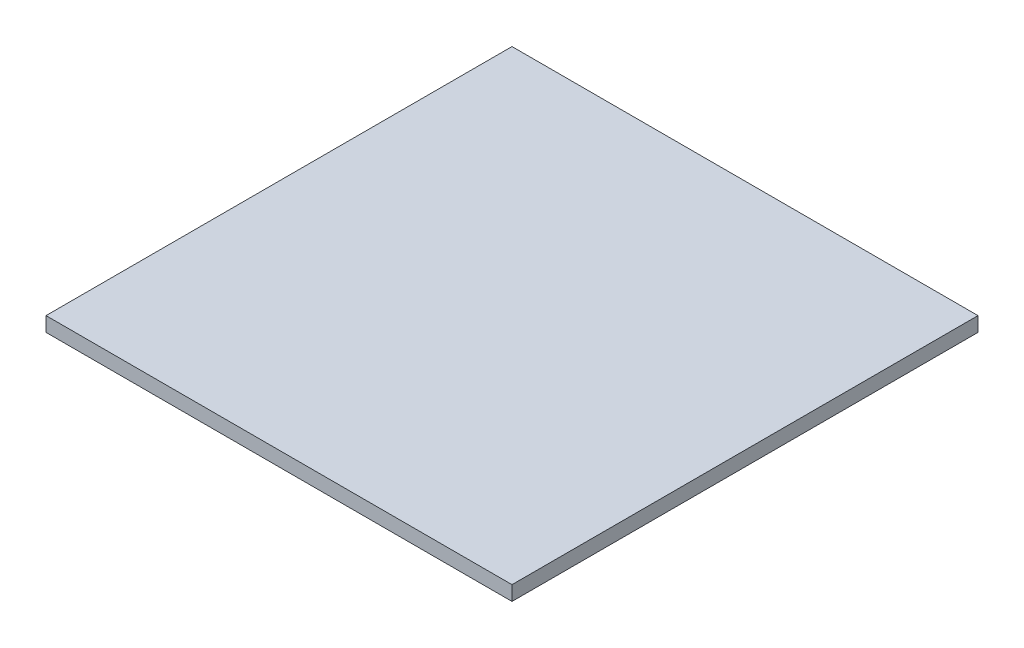
ISO-10303-21;
HEADER;
FILE_DESCRIPTION(('STEP AP214'),'2;1');
FILE_NAME('part.step','',(''),(''),'','','');
FILE_SCHEMA(('AUTOMOTIVE_DESIGN { 1 0 10303 214 1 1 1 1 }'));
ENDSEC;
DATA;
#1=APPLICATION_CONTEXT('core data for automotive mechanical design processes');
#2=APPLICATION_PROTOCOL_DEFINITION('international standard','automotive_design',2000,#1);
#3=PRODUCT_CONTEXT('',#1,'mechanical');
#4=PRODUCT('Part','Part','',(#3));
#5=PRODUCT_RELATED_PRODUCT_CATEGORY('part','',(#4));
#6=PRODUCT_DEFINITION_FORMATION('','',#4);
#7=PRODUCT_DEFINITION_CONTEXT('part definition',#1,'design');
#8=PRODUCT_DEFINITION('design','',#6,#7);
#9=PRODUCT_DEFINITION_SHAPE('','',#8);
#10=(LENGTH_UNIT() NAMED_UNIT(*) SI_UNIT(.MILLI.,.METRE.));
#11=(NAMED_UNIT(*) PLANE_ANGLE_UNIT() SI_UNIT($,.RADIAN.));
#12=(NAMED_UNIT(*) SI_UNIT($,.STERADIAN.) SOLID_ANGLE_UNIT());
#13=UNCERTAINTY_MEASURE_WITH_UNIT(LENGTH_MEASURE(1.E-05),#10,'distance_accuracy_value','');
#14=(GEOMETRIC_REPRESENTATION_CONTEXT(3) GLOBAL_UNCERTAINTY_ASSIGNED_CONTEXT((#13)) GLOBAL_UNIT_ASSIGNED_CONTEXT((#10,
#11,#12)) REPRESENTATION_CONTEXT('',''));
#15=CARTESIAN_POINT('',(0.,0.,0.));
#16=DIRECTION('',(0.,0.,1.));
#17=DIRECTION('',(1.,0.,0.));
#18=AXIS2_PLACEMENT_3D('',#15,#16,#17);
#19=CARTESIAN_POINT('',(0.,1.5875,0.));
#20=DIRECTION('',(1.,0.,0.));
#21=DIRECTION('',(0.,0.,-1.));
#22=AXIS2_PLACEMENT_3D('',#19,#20,#21);
#23=PLANE('',#22);
#24=DIRECTION('',(0.,0.,1.));
#25=VECTOR('',#24,1.);
#26=CARTESIAN_POINT('',(0.,0.,0.));
#27=LINE('',#26,#25);
#28=CARTESIAN_POINT('',(0.,0.,-50.8));
#29=VERTEX_POINT('',#28);
#30=CARTESIAN_POINT('',(0.,0.,0.));
#31=VERTEX_POINT('',#30);
#32=EDGE_CURVE('E96',#29,#31,#27,.T.);
#33=ORIENTED_EDGE('',*,*,#32,.T.);
#34=DIRECTION('',(0.,-1.,0.));
#35=VECTOR('',#34,1.);
#36=CARTESIAN_POINT('',(0.,1.5875,0.));
#37=LINE('',#36,#35);
#38=CARTESIAN_POINT('',(0.,1.5875,0.));
#39=VERTEX_POINT('',#38);
#40=EDGE_CURVE('E11',#39,#31,#37,.T.);
#41=ORIENTED_EDGE('',*,*,#40,.F.);
#42=DIRECTION('',(0.,0.,1.));
#43=VECTOR('',#42,1.);
#44=CARTESIAN_POINT('',(0.,1.5875,0.));
#45=LINE('',#44,#43);
#46=CARTESIAN_POINT('',(0.,1.5875,-50.8));
#47=VERTEX_POINT('',#46);
#48=EDGE_CURVE('E84',#47,#39,#45,.T.);
#49=ORIENTED_EDGE('',*,*,#48,.F.);
#50=DIRECTION('',(0.,-1.,0.));
#51=VECTOR('',#50,1.);
#52=CARTESIAN_POINT('',(0.,1.5875,-50.8));
#53=LINE('',#52,#51);
#54=EDGE_CURVE('E92',#47,#29,#53,.T.);
#55=ORIENTED_EDGE('',*,*,#54,.T.);
#56=EDGE_LOOP('',(#33,#41,#49,#55));
#57=FACE_BOUND('',#56,.T.);
#58=ADVANCED_FACE('F33',(#57),#23,.F.);
#59=CARTESIAN_POINT('',(0.,1.5875,0.));
#60=DIRECTION('',(0.,0.,-1.));
#61=DIRECTION('',(-1.,0.,0.));
#62=AXIS2_PLACEMENT_3D('',#59,#60,#61);
#63=PLANE('',#62);
#64=DIRECTION('',(1.,0.,0.));
#65=VECTOR('',#64,1.);
#66=CARTESIAN_POINT('',(0.,0.,0.));
#67=LINE('',#66,#65);
#68=CARTESIAN_POINT('',(50.8,0.,0.));
#69=VERTEX_POINT('',#68);
#70=EDGE_CURVE('E88',#31,#69,#67,.T.);
#71=ORIENTED_EDGE('',*,*,#70,.T.);
#72=DIRECTION('',(0.,-1.,0.));
#73=VECTOR('',#72,1.);
#74=CARTESIAN_POINT('',(50.8,1.5875,0.));
#75=LINE('',#74,#73);
#76=CARTESIAN_POINT('',(50.8,1.5875,0.));
#77=VERTEX_POINT('',#76);
#78=EDGE_CURVE('E41',#77,#69,#75,.T.);
#79=ORIENTED_EDGE('',*,*,#78,.F.);
#80=DIRECTION('',(1.,0.,0.));
#81=VECTOR('',#80,1.);
#82=CARTESIAN_POINT('',(0.,1.5875,0.));
#83=LINE('',#82,#81);
#84=EDGE_CURVE('E79',#39,#77,#83,.T.);
#85=ORIENTED_EDGE('',*,*,#84,.F.);
#86=ORIENTED_EDGE('',*,*,#40,.T.);
#87=EDGE_LOOP('',(#71,#79,#85,#86));
#88=FACE_BOUND('',#87,.T.);
#89=ADVANCED_FACE('F87',(#88),#63,.F.);
#90=CARTESIAN_POINT('',(50.8,1.5875,0.));
#91=DIRECTION('',(-1.,0.,0.));
#92=DIRECTION('',(0.,0.,1.));
#93=AXIS2_PLACEMENT_3D('',#90,#91,#92);
#94=PLANE('',#93);
#95=DIRECTION('',(0.,0.,-1.));
#96=VECTOR('',#95,1.);
#97=CARTESIAN_POINT('',(50.8,0.,0.));
#98=LINE('',#97,#96);
#99=CARTESIAN_POINT('',(50.8,0.,-50.8));
#100=VERTEX_POINT('',#99);
#101=EDGE_CURVE('E66',#69,#100,#98,.T.);
#102=ORIENTED_EDGE('',*,*,#101,.T.);
#103=DIRECTION('',(0.,-1.,0.));
#104=VECTOR('',#103,1.);
#105=CARTESIAN_POINT('',(50.8,1.5875,-50.8));
#106=LINE('',#105,#104);
#107=CARTESIAN_POINT('',(50.8,1.5875,-50.8));
#108=VERTEX_POINT('',#107);
#109=EDGE_CURVE('E89',#108,#100,#106,.T.);
#110=ORIENTED_EDGE('',*,*,#109,.F.);
#111=DIRECTION('',(0.,0.,-1.));
#112=VECTOR('',#111,1.);
#113=CARTESIAN_POINT('',(50.8,1.5875,0.));
#114=LINE('',#113,#112);
#115=EDGE_CURVE('E82',#77,#108,#114,.T.);
#116=ORIENTED_EDGE('',*,*,#115,.F.);
#117=ORIENTED_EDGE('',*,*,#78,.T.);
#118=EDGE_LOOP('',(#102,#110,#116,#117));
#119=FACE_BOUND('',#118,.T.);
#120=ADVANCED_FACE('F90',(#119),#94,.F.);
#121=CARTESIAN_POINT('',(0.,1.5875,-50.8));
#122=DIRECTION('',(0.,0.,1.));
#123=DIRECTION('',(1.,0.,0.));
#124=AXIS2_PLACEMENT_3D('',#121,#122,#123);
#125=PLANE('',#124);
#126=DIRECTION('',(-1.,0.,0.));
#127=VECTOR('',#126,1.);
#128=CARTESIAN_POINT('',(0.,0.,-50.8));
#129=LINE('',#128,#127);
#130=EDGE_CURVE('E72',#100,#29,#129,.T.);
#131=ORIENTED_EDGE('',*,*,#130,.T.);
#132=ORIENTED_EDGE('',*,*,#54,.F.);
#133=DIRECTION('',(-1.,0.,0.));
#134=VECTOR('',#133,1.);
#135=CARTESIAN_POINT('',(0.,1.5875,-50.8));
#136=LINE('',#135,#134);
#137=EDGE_CURVE('E49',#108,#47,#136,.T.);
#138=ORIENTED_EDGE('',*,*,#137,.F.);
#139=ORIENTED_EDGE('',*,*,#109,.T.);
#140=EDGE_LOOP('',(#131,#132,#138,#139));
#141=FACE_BOUND('',#140,.T.);
#142=ADVANCED_FACE('F103',(#141),#125,.F.);
#143=CARTESIAN_POINT('',(0.,1.5875,0.));
#144=DIRECTION('',(0.,-1.,0.));
#145=DIRECTION('',(0.,0.,-1.));
#146=AXIS2_PLACEMENT_3D('',#143,#144,#145);
#147=PLANE('',#146);
#148=ORIENTED_EDGE('',*,*,#48,.T.);
#149=ORIENTED_EDGE('',*,*,#84,.T.);
#150=ORIENTED_EDGE('',*,*,#115,.T.);
#151=ORIENTED_EDGE('',*,*,#137,.T.);
#152=EDGE_LOOP('',(#148,#149,#150,#151));
#153=FACE_BOUND('',#152,.T.);
#154=ADVANCED_FACE('F80',(#153),#147,.F.);
#155=CARTESIAN_POINT('',(0.,0.,0.));
#156=DIRECTION('',(0.,-1.,0.));
#157=DIRECTION('',(0.,0.,-1.));
#158=AXIS2_PLACEMENT_3D('',#155,#156,#157);
#159=PLANE('',#158);
#160=ORIENTED_EDGE('',*,*,#32,.F.);
#161=ORIENTED_EDGE('',*,*,#130,.F.);
#162=ORIENTED_EDGE('',*,*,#101,.F.);
#163=ORIENTED_EDGE('',*,*,#70,.F.);
#164=EDGE_LOOP('',(#160,#161,#162,#163));
#165=FACE_BOUND('',#164,.T.);
#166=ADVANCED_FACE('F106',(#165),#159,.T.);
#167=CLOSED_SHELL('',(#58,#89,#120,#142,#154,#166));
#168=MANIFOLD_SOLID_BREP('B2',#167);
#169=ADVANCED_BREP_SHAPE_REPRESENTATION('',(#18,#168),#14);
#170=SHAPE_DEFINITION_REPRESENTATION(#9,#169);
ENDSEC;
END-ISO-10303-21;
